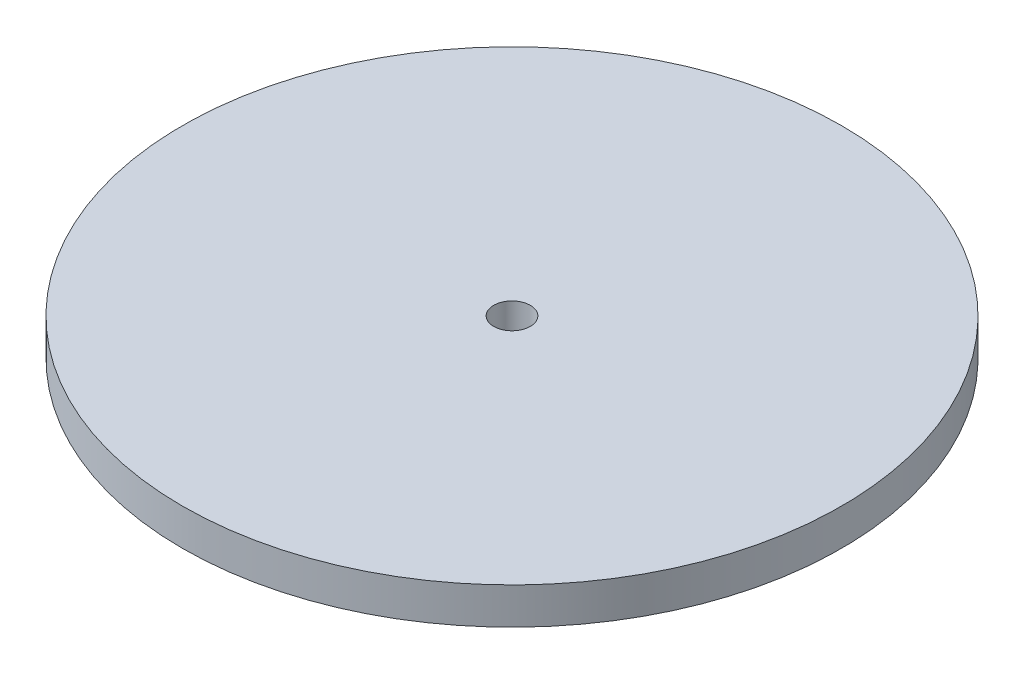
ISO-10303-21;
HEADER;
FILE_DESCRIPTION(('STEP AP214'),'2;1');
FILE_NAME('part.step','',(''),(''),'','','');
FILE_SCHEMA(('AUTOMOTIVE_DESIGN { 1 0 10303 214 1 1 1 1 }'));
ENDSEC;
DATA;
#1=APPLICATION_CONTEXT('core data for automotive mechanical design processes');
#2=APPLICATION_PROTOCOL_DEFINITION('international standard','automotive_design',2000,#1);
#3=PRODUCT_CONTEXT('',#1,'mechanical');
#4=PRODUCT('Part','Part','',(#3));
#5=PRODUCT_RELATED_PRODUCT_CATEGORY('part','',(#4));
#6=PRODUCT_DEFINITION_FORMATION('','',#4);
#7=PRODUCT_DEFINITION_CONTEXT('part definition',#1,'design');
#8=PRODUCT_DEFINITION('design','',#6,#7);
#9=PRODUCT_DEFINITION_SHAPE('','',#8);
#10=(LENGTH_UNIT() NAMED_UNIT(*) SI_UNIT(.MILLI.,.METRE.));
#11=(NAMED_UNIT(*) PLANE_ANGLE_UNIT() SI_UNIT($,.RADIAN.));
#12=(NAMED_UNIT(*) SI_UNIT($,.STERADIAN.) SOLID_ANGLE_UNIT());
#13=UNCERTAINTY_MEASURE_WITH_UNIT(LENGTH_MEASURE(1.E-05),#10,'distance_accuracy_value','');
#14=(GEOMETRIC_REPRESENTATION_CONTEXT(3) GLOBAL_UNCERTAINTY_ASSIGNED_CONTEXT((#13)) GLOBAL_UNIT_ASSIGNED_CONTEXT((#10,
#11,#12)) REPRESENTATION_CONTEXT('',''));
#15=CARTESIAN_POINT('',(0.,0.,0.));
#16=DIRECTION('',(0.,0.,1.));
#17=DIRECTION('',(1.,0.,0.));
#18=AXIS2_PLACEMENT_3D('',#15,#16,#17);
#19=CARTESIAN_POINT('',(0.,5.,0.));
#20=DIRECTION('',(0.,1.,0.));
#21=DIRECTION('',(0.,0.,1.));
#22=AXIS2_PLACEMENT_3D('',#19,#20,#21);
#23=PLANE('',#22);
#24=CARTESIAN_POINT('',(0.,5.,0.));
#25=DIRECTION('',(0.,1.,0.));
#26=DIRECTION('',(0.,0.,1.));
#27=AXIS2_PLACEMENT_3D('',#24,#25,#26);
#28=CIRCLE('',#27,45.);
#29=CARTESIAN_POINT('',(0.,5.,45.));
#30=VERTEX_POINT('',#29);
#31=EDGE_CURVE('E10',#30,#30,#28,.T.);
#32=ORIENTED_EDGE('',*,*,#31,.T.);
#33=EDGE_LOOP('',(#32));
#34=FACE_BOUND('',#33,.T.);
#35=CARTESIAN_POINT('',(0.,5.,0.));
#36=DIRECTION('',(0.,1.,0.));
#37=DIRECTION('',(0.,0.,1.));
#38=AXIS2_PLACEMENT_3D('',#35,#36,#37);
#39=CIRCLE('',#38,2.5);
#40=CARTESIAN_POINT('',(0.,5.,2.5));
#41=VERTEX_POINT('',#40);
#42=EDGE_CURVE('E41',#41,#41,#39,.T.);
#43=ORIENTED_EDGE('',*,*,#42,.F.);
#44=EDGE_LOOP('',(#43));
#45=FACE_BOUND('',#44,.T.);
#46=ADVANCED_FACE('F30',(#34,#45),#23,.T.);
#47=CARTESIAN_POINT('',(0.,0.,0.));
#48=DIRECTION('',(0.,1.,0.));
#49=DIRECTION('',(0.,0.,1.));
#50=AXIS2_PLACEMENT_3D('',#47,#48,#49);
#51=PLANE('',#50);
#52=CARTESIAN_POINT('',(0.,0.,0.));
#53=DIRECTION('',(0.,1.,0.));
#54=DIRECTION('',(0.,0.,1.));
#55=AXIS2_PLACEMENT_3D('',#52,#53,#54);
#56=CIRCLE('',#55,45.);
#57=CARTESIAN_POINT('',(0.,0.,45.));
#58=VERTEX_POINT('',#57);
#59=EDGE_CURVE('E34',#58,#58,#56,.T.);
#60=ORIENTED_EDGE('',*,*,#59,.F.);
#61=EDGE_LOOP('',(#60));
#62=FACE_BOUND('',#61,.T.);
#63=CARTESIAN_POINT('',(0.,0.,0.));
#64=DIRECTION('',(0.,1.,0.));
#65=DIRECTION('',(0.,0.,1.));
#66=AXIS2_PLACEMENT_3D('',#63,#64,#65);
#67=CIRCLE('',#66,2.5);
#68=CARTESIAN_POINT('',(0.,0.,2.5));
#69=VERTEX_POINT('',#68);
#70=EDGE_CURVE('E43',#69,#69,#67,.T.);
#71=ORIENTED_EDGE('',*,*,#70,.T.);
#72=EDGE_LOOP('',(#71));
#73=FACE_BOUND('',#72,.T.);
#74=ADVANCED_FACE('F53',(#62,#73),#51,.F.);
#75=CARTESIAN_POINT('',(0.,5.,0.));
#76=DIRECTION('',(0.,-1.,0.));
#77=DIRECTION('',(0.,0.,-1.));
#78=AXIS2_PLACEMENT_3D('',#75,#76,#77);
#79=CYLINDRICAL_SURFACE('',#78,45.);
#80=ORIENTED_EDGE('',*,*,#31,.F.);
#81=EDGE_LOOP('',(#80));
#82=FACE_BOUND('',#81,.T.);
#83=ORIENTED_EDGE('',*,*,#59,.T.);
#84=EDGE_LOOP('',(#83));
#85=FACE_BOUND('',#84,.T.);
#86=ADVANCED_FACE('F32',(#82,#85),#79,.T.);
#87=CARTESIAN_POINT('',(0.,5.,0.));
#88=DIRECTION('',(0.,-1.,0.));
#89=DIRECTION('',(0.,0.,-1.));
#90=AXIS2_PLACEMENT_3D('',#87,#88,#89);
#91=CYLINDRICAL_SURFACE('',#90,2.5);
#92=ORIENTED_EDGE('',*,*,#42,.T.);
#93=EDGE_LOOP('',(#92));
#94=FACE_BOUND('',#93,.T.);
#95=ORIENTED_EDGE('',*,*,#70,.F.);
#96=EDGE_LOOP('',(#95));
#97=FACE_BOUND('',#96,.T.);
#98=ADVANCED_FACE('F49',(#94,#97),#91,.F.);
#99=CLOSED_SHELL('',(#46,#74,#86,#98));
#100=MANIFOLD_SOLID_BREP('B2',#99);
#101=ADVANCED_BREP_SHAPE_REPRESENTATION('',(#18,#100),#14);
#102=SHAPE_DEFINITION_REPRESENTATION(#9,#101);
ENDSEC;
END-ISO-10303-21;
